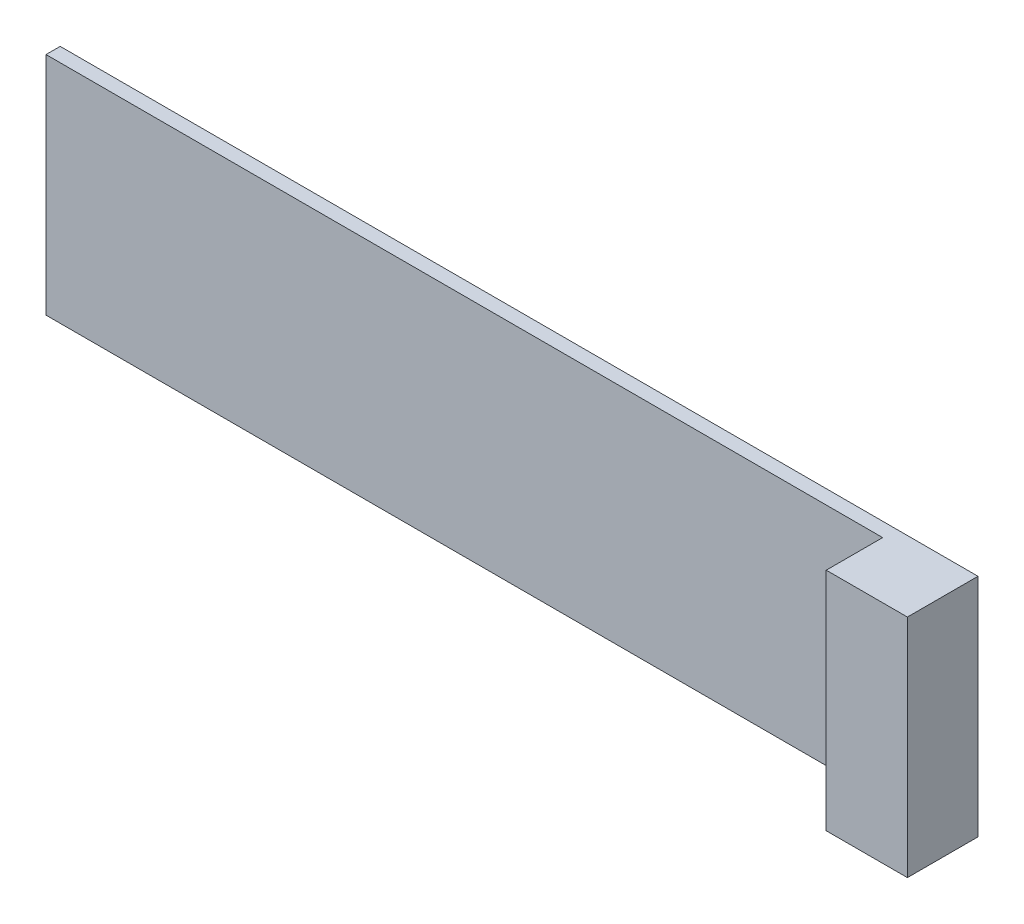
ISO-10303-21;
HEADER;
FILE_DESCRIPTION(('STEP AP214'),'2;1');
FILE_NAME('part.step','',(''),(''),'','','');
FILE_SCHEMA(('AUTOMOTIVE_DESIGN { 1 0 10303 214 1 1 1 1 }'));
ENDSEC;
DATA;
#1=APPLICATION_CONTEXT('core data for automotive mechanical design processes');
#2=APPLICATION_PROTOCOL_DEFINITION('international standard','automotive_design',2000,#1);
#3=PRODUCT_CONTEXT('',#1,'mechanical');
#4=PRODUCT('Part','Part','',(#3));
#5=PRODUCT_RELATED_PRODUCT_CATEGORY('part','',(#4));
#6=PRODUCT_DEFINITION_FORMATION('','',#4);
#7=PRODUCT_DEFINITION_CONTEXT('part definition',#1,'design');
#8=PRODUCT_DEFINITION('design','',#6,#7);
#9=PRODUCT_DEFINITION_SHAPE('','',#8);
#10=(LENGTH_UNIT() NAMED_UNIT(*) SI_UNIT(.MILLI.,.METRE.));
#11=(NAMED_UNIT(*) PLANE_ANGLE_UNIT() SI_UNIT($,.RADIAN.));
#12=(NAMED_UNIT(*) SI_UNIT($,.STERADIAN.) SOLID_ANGLE_UNIT());
#13=UNCERTAINTY_MEASURE_WITH_UNIT(LENGTH_MEASURE(1.E-05),#10,'distance_accuracy_value','');
#14=(GEOMETRIC_REPRESENTATION_CONTEXT(3) GLOBAL_UNCERTAINTY_ASSIGNED_CONTEXT((#13)) GLOBAL_UNIT_ASSIGNED_CONTEXT((#10,
#11,#12)) REPRESENTATION_CONTEXT('',''));
#15=CARTESIAN_POINT('',(0.,0.,0.));
#16=DIRECTION('',(0.,0.,1.));
#17=DIRECTION('',(1.,0.,0.));
#18=AXIS2_PLACEMENT_3D('',#15,#16,#17);
#19=CARTESIAN_POINT('',(4.153,0.406,0.051));
#20=DIRECTION('',(0.,0.,1.));
#21=DIRECTION('',(1.,0.,0.));
#22=AXIS2_PLACEMENT_3D('',#19,#20,#21);
#23=PLANE('',#22);
#24=DIRECTION('',(1.,0.,0.));
#25=VECTOR('',#24,1.);
#26=CARTESIAN_POINT('',(1.143,-0.406,0.051));
#27=LINE('',#26,#25);
#28=CARTESIAN_POINT('',(4.153,-0.406,0.051));
#29=VERTEX_POINT('',#28);
#30=CARTESIAN_POINT('',(1.143,-0.406,0.051));
#31=VERTEX_POINT('',#30);
#32=EDGE_CURVE('E83',#29,#31,#27,.F.);
#33=ORIENTED_EDGE('',*,*,#32,.F.);
#34=DIRECTION('',(0.,1.,0.));
#35=VECTOR('',#34,1.);
#36=CARTESIAN_POINT('',(4.153,0.406,0.051));
#37=LINE('',#36,#35);
#38=CARTESIAN_POINT('',(4.153,0.406,0.051));
#39=VERTEX_POINT('',#38);
#40=EDGE_CURVE('E20',#39,#29,#37,.F.);
#41=ORIENTED_EDGE('',*,*,#40,.F.);
#42=DIRECTION('',(1.,0.,0.));
#43=VECTOR('',#42,1.);
#44=CARTESIAN_POINT('',(4.445,0.406,0.051));
#45=LINE('',#44,#43);
#46=CARTESIAN_POINT('',(1.143,0.406,0.051));
#47=VERTEX_POINT('',#46);
#48=EDGE_CURVE('E100',#47,#39,#45,.T.);
#49=ORIENTED_EDGE('',*,*,#48,.F.);
#50=DIRECTION('',(0.,1.,0.));
#51=VECTOR('',#50,1.);
#52=CARTESIAN_POINT('',(1.143,0.406,0.051));
#53=LINE('',#52,#51);
#54=EDGE_CURVE('E95',#31,#47,#53,.T.);
#55=ORIENTED_EDGE('',*,*,#54,.F.);
#56=EDGE_LOOP('',(#33,#41,#49,#55));
#57=FACE_BOUND('',#56,.T.);
#58=ADVANCED_FACE('F17',(#57),#23,.T.);
#59=CARTESIAN_POINT('',(4.153,0.406,0.051));
#60=DIRECTION('',(-1.,0.,0.));
#61=DIRECTION('',(0.,0.,1.));
#62=AXIS2_PLACEMENT_3D('',#59,#60,#61);
#63=PLANE('',#62);
#64=DIRECTION('',(0.,1.,0.));
#65=VECTOR('',#64,1.);
#66=CARTESIAN_POINT('',(4.153,0.406,0.254));
#67=LINE('',#66,#65);
#68=CARTESIAN_POINT('',(4.153,0.406,0.254));
#69=VERTEX_POINT('',#68);
#70=CARTESIAN_POINT('',(4.153,-0.406,0.254));
#71=VERTEX_POINT('',#70);
#72=EDGE_CURVE('E71',#69,#71,#67,.F.);
#73=ORIENTED_EDGE('',*,*,#72,.F.);
#74=DIRECTION('',(0.,0.,1.));
#75=VECTOR('',#74,1.);
#76=CARTESIAN_POINT('',(4.153,0.406,0.));
#77=LINE('',#76,#75);
#78=EDGE_CURVE('E103',#39,#69,#77,.T.);
#79=ORIENTED_EDGE('',*,*,#78,.F.);
#80=ORIENTED_EDGE('',*,*,#40,.T.);
#81=DIRECTION('',(0.,0.,-1.));
#82=VECTOR('',#81,1.);
#83=CARTESIAN_POINT('',(4.153,-0.406,0.));
#84=LINE('',#83,#82);
#85=EDGE_CURVE('E80',#71,#29,#84,.T.);
#86=ORIENTED_EDGE('',*,*,#85,.F.);
#87=EDGE_LOOP('',(#73,#79,#80,#86));
#88=FACE_BOUND('',#87,.T.);
#89=ADVANCED_FACE('F81',(#88),#63,.T.);
#90=CARTESIAN_POINT('',(4.445,0.406,0.254));
#91=DIRECTION('',(0.,0.,1.));
#92=DIRECTION('',(1.,0.,0.));
#93=AXIS2_PLACEMENT_3D('',#90,#91,#92);
#94=PLANE('',#93);
#95=DIRECTION('',(1.,0.,0.));
#96=VECTOR('',#95,1.);
#97=CARTESIAN_POINT('',(1.143,-0.406,0.254));
#98=LINE('',#97,#96);
#99=CARTESIAN_POINT('',(4.445,-0.406,0.254));
#100=VERTEX_POINT('',#99);
#101=EDGE_CURVE('E75',#100,#71,#98,.F.);
#102=ORIENTED_EDGE('',*,*,#101,.F.);
#103=DIRECTION('',(0.,1.,0.));
#104=VECTOR('',#103,1.);
#105=CARTESIAN_POINT('',(4.445,-0.406,0.254));
#106=LINE('',#105,#104);
#107=CARTESIAN_POINT('',(4.445,0.406,0.254));
#108=VERTEX_POINT('',#107);
#109=EDGE_CURVE('E107',#108,#100,#106,.F.);
#110=ORIENTED_EDGE('',*,*,#109,.F.);
#111=DIRECTION('',(1.,0.,0.));
#112=VECTOR('',#111,1.);
#113=CARTESIAN_POINT('',(4.445,0.406,0.254));
#114=LINE('',#113,#112);
#115=EDGE_CURVE('E77',#69,#108,#114,.T.);
#116=ORIENTED_EDGE('',*,*,#115,.F.);
#117=ORIENTED_EDGE('',*,*,#72,.T.);
#118=EDGE_LOOP('',(#102,#110,#116,#117));
#119=FACE_BOUND('',#118,.T.);
#120=ADVANCED_FACE('F72',(#119),#94,.T.);
#121=CARTESIAN_POINT('',(1.143,-0.406,0.));
#122=DIRECTION('',(0.,-1.,0.));
#123=DIRECTION('',(0.,0.,-1.));
#124=AXIS2_PLACEMENT_3D('',#121,#122,#123);
#125=PLANE('',#124);
#126=ORIENTED_EDGE('',*,*,#32,.T.);
#127=DIRECTION('',(0.,0.,1.));
#128=VECTOR('',#127,1.);
#129=CARTESIAN_POINT('',(1.143,-0.406,0.));
#130=LINE('',#129,#128);
#131=CARTESIAN_POINT('',(1.143,-0.406,0.));
#132=VERTEX_POINT('',#131);
#133=EDGE_CURVE('E92',#132,#31,#130,.T.);
#134=ORIENTED_EDGE('',*,*,#133,.F.);
#135=DIRECTION('',(-1.,0.,0.));
#136=VECTOR('',#135,1.);
#137=CARTESIAN_POINT('',(4.445,-0.406,0.));
#138=LINE('',#137,#136);
#139=CARTESIAN_POINT('',(4.445,-0.406,0.));
#140=VERTEX_POINT('',#139);
#141=EDGE_CURVE('E110',#140,#132,#138,.T.);
#142=ORIENTED_EDGE('',*,*,#141,.F.);
#143=DIRECTION('',(0.,0.,-1.));
#144=VECTOR('',#143,1.);
#145=CARTESIAN_POINT('',(4.445,-0.406,0.));
#146=LINE('',#145,#144);
#147=EDGE_CURVE('E87',#100,#140,#146,.T.);
#148=ORIENTED_EDGE('',*,*,#147,.F.);
#149=ORIENTED_EDGE('',*,*,#101,.T.);
#150=ORIENTED_EDGE('',*,*,#85,.T.);
#151=EDGE_LOOP('',(#126,#134,#142,#148,#149,#150));
#152=FACE_BOUND('',#151,.T.);
#153=ADVANCED_FACE('F85',(#152),#125,.T.);
#154=CARTESIAN_POINT('',(1.143,0.406,0.));
#155=DIRECTION('',(-1.,0.,0.));
#156=DIRECTION('',(0.,0.,1.));
#157=AXIS2_PLACEMENT_3D('',#154,#155,#156);
#158=PLANE('',#157);
#159=ORIENTED_EDGE('',*,*,#54,.T.);
#160=DIRECTION('',(0.,0.,1.));
#161=VECTOR('',#160,1.);
#162=CARTESIAN_POINT('',(1.143,0.406,0.));
#163=LINE('',#162,#161);
#164=CARTESIAN_POINT('',(1.143,0.406,0.));
#165=VERTEX_POINT('',#164);
#166=EDGE_CURVE('E97',#165,#47,#163,.T.);
#167=ORIENTED_EDGE('',*,*,#166,.F.);
#168=DIRECTION('',(0.,1.,0.));
#169=VECTOR('',#168,1.);
#170=CARTESIAN_POINT('',(1.143,-0.406,0.));
#171=LINE('',#170,#169);
#172=EDGE_CURVE('E113',#132,#165,#171,.T.);
#173=ORIENTED_EDGE('',*,*,#172,.F.);
#174=ORIENTED_EDGE('',*,*,#133,.T.);
#175=EDGE_LOOP('',(#159,#167,#173,#174));
#176=FACE_BOUND('',#175,.T.);
#177=ADVANCED_FACE('F123',(#176),#158,.T.);
#178=CARTESIAN_POINT('',(4.445,0.406,0.));
#179=DIRECTION('',(0.,1.,0.));
#180=DIRECTION('',(0.,0.,1.));
#181=AXIS2_PLACEMENT_3D('',#178,#179,#180);
#182=PLANE('',#181);
#183=ORIENTED_EDGE('',*,*,#115,.T.);
#184=DIRECTION('',(0.,0.,-1.));
#185=VECTOR('',#184,1.);
#186=CARTESIAN_POINT('',(4.445,0.406,0.));
#187=LINE('',#186,#185);
#188=CARTESIAN_POINT('',(4.445,0.406,0.));
#189=VERTEX_POINT('',#188);
#190=EDGE_CURVE('E35',#189,#108,#187,.F.);
#191=ORIENTED_EDGE('',*,*,#190,.F.);
#192=DIRECTION('',(-1.,0.,0.));
#193=VECTOR('',#192,1.);
#194=CARTESIAN_POINT('',(4.445,0.406,0.));
#195=LINE('',#194,#193);
#196=EDGE_CURVE('E26',#165,#189,#195,.F.);
#197=ORIENTED_EDGE('',*,*,#196,.F.);
#198=ORIENTED_EDGE('',*,*,#166,.T.);
#199=ORIENTED_EDGE('',*,*,#48,.T.);
#200=ORIENTED_EDGE('',*,*,#78,.T.);
#201=EDGE_LOOP('',(#183,#191,#197,#198,#199,#200));
#202=FACE_BOUND('',#201,.T.);
#203=ADVANCED_FACE('F120',(#202),#182,.T.);
#204=CARTESIAN_POINT('',(4.445,-0.406,0.));
#205=DIRECTION('',(1.,0.,0.));
#206=DIRECTION('',(0.,0.,-1.));
#207=AXIS2_PLACEMENT_3D('',#204,#205,#206);
#208=PLANE('',#207);
#209=ORIENTED_EDGE('',*,*,#109,.T.);
#210=ORIENTED_EDGE('',*,*,#147,.T.);
#211=DIRECTION('',(0.,1.,0.));
#212=VECTOR('',#211,1.);
#213=CARTESIAN_POINT('',(4.445,-0.406,0.));
#214=LINE('',#213,#212);
#215=EDGE_CURVE('E11',#189,#140,#214,.F.);
#216=ORIENTED_EDGE('',*,*,#215,.F.);
#217=ORIENTED_EDGE('',*,*,#190,.T.);
#218=EDGE_LOOP('',(#209,#210,#216,#217));
#219=FACE_BOUND('',#218,.T.);
#220=ADVANCED_FACE('F127',(#219),#208,.T.);
#221=CARTESIAN_POINT('',(4.445,-0.406,0.));
#222=DIRECTION('',(0.,0.,-1.));
#223=DIRECTION('',(-1.,0.,0.));
#224=AXIS2_PLACEMENT_3D('',#221,#222,#223);
#225=PLANE('',#224);
#226=ORIENTED_EDGE('',*,*,#196,.T.);
#227=ORIENTED_EDGE('',*,*,#215,.T.);
#228=ORIENTED_EDGE('',*,*,#141,.T.);
#229=ORIENTED_EDGE('',*,*,#172,.T.);
#230=EDGE_LOOP('',(#226,#227,#228,#229));
#231=FACE_BOUND('',#230,.T.);
#232=ADVANCED_FACE('F118',(#231),#225,.T.);
#233=CLOSED_SHELL('',(#58,#89,#120,#153,#177,#203,#220,#232));
#234=MANIFOLD_SOLID_BREP('B1',#233);
#235=ADVANCED_BREP_SHAPE_REPRESENTATION('',(#18,#234),#14);
#236=SHAPE_DEFINITION_REPRESENTATION(#9,#235);
ENDSEC;
END-ISO-10303-21;
